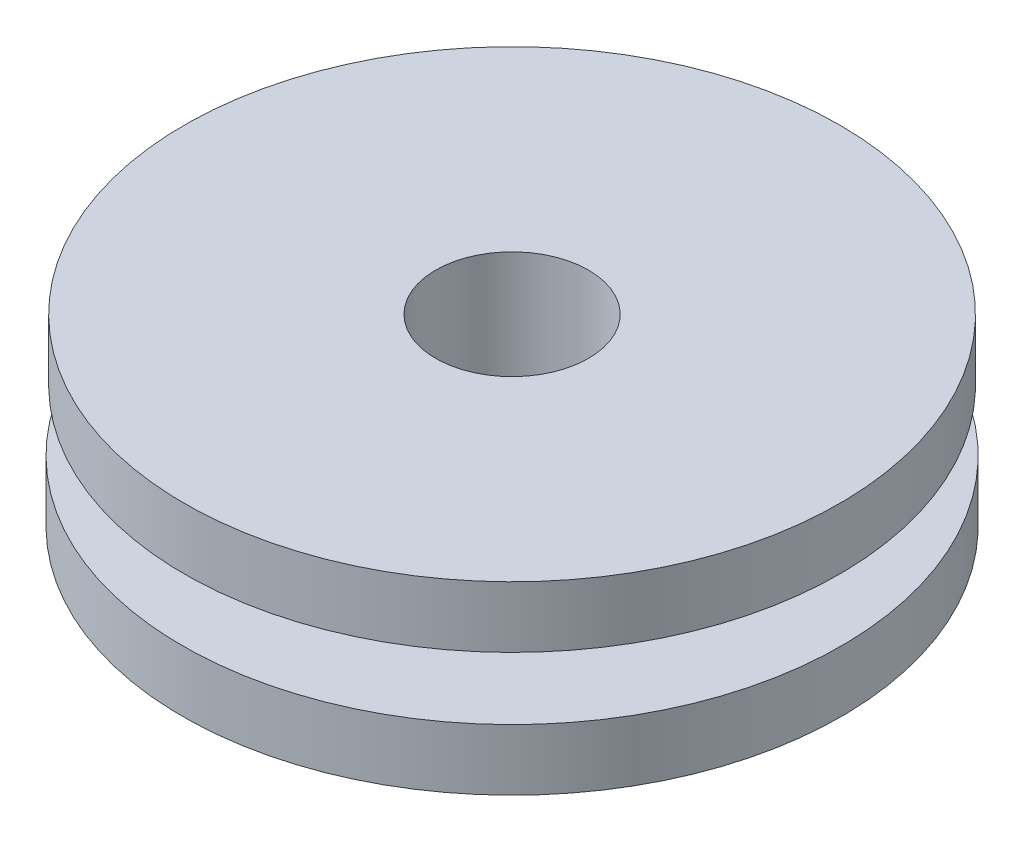
ISO-10303-21;
HEADER;
FILE_DESCRIPTION(('STEP AP214'),'2;1');
FILE_NAME('part.step','',(''),(''),'','','');
FILE_SCHEMA(('AUTOMOTIVE_DESIGN { 1 0 10303 214 1 1 1 1 }'));
ENDSEC;
DATA;
#1=APPLICATION_CONTEXT('core data for automotive mechanical design processes');
#2=APPLICATION_PROTOCOL_DEFINITION('international standard','automotive_design',2000,#1);
#3=PRODUCT_CONTEXT('',#1,'mechanical');
#4=PRODUCT('Part','Part','',(#3));
#5=PRODUCT_RELATED_PRODUCT_CATEGORY('part','',(#4));
#6=PRODUCT_DEFINITION_FORMATION('','',#4);
#7=PRODUCT_DEFINITION_CONTEXT('part definition',#1,'design');
#8=PRODUCT_DEFINITION('design','',#6,#7);
#9=PRODUCT_DEFINITION_SHAPE('','',#8);
#10=(LENGTH_UNIT() NAMED_UNIT(*) SI_UNIT(.MILLI.,.METRE.));
#11=(NAMED_UNIT(*) PLANE_ANGLE_UNIT() SI_UNIT($,.RADIAN.));
#12=(NAMED_UNIT(*) SI_UNIT($,.STERADIAN.) SOLID_ANGLE_UNIT());
#13=UNCERTAINTY_MEASURE_WITH_UNIT(LENGTH_MEASURE(1.E-05),#10,'distance_accuracy_value','');
#14=(GEOMETRIC_REPRESENTATION_CONTEXT(3) GLOBAL_UNCERTAINTY_ASSIGNED_CONTEXT((#13)) GLOBAL_UNIT_ASSIGNED_CONTEXT((#10,
#11,#12)) REPRESENTATION_CONTEXT('',''));
#15=CARTESIAN_POINT('',(0.,0.,0.));
#16=DIRECTION('',(0.,0.,1.));
#17=DIRECTION('',(1.,0.,0.));
#18=AXIS2_PLACEMENT_3D('',#15,#16,#17);
#19=CARTESIAN_POINT('',(0.,-14.9998814377917,0.0274087506036777));
#20=DIRECTION('',(0.,1.,0.));
#21=DIRECTION('',(0.,0.,1.));
#22=AXIS2_PLACEMENT_3D('',#19,#20,#21);
#23=PLANE('',#22);
#24=CARTESIAN_POINT('',(0.,-14.9998814377917,-38.456139131109));
#25=DIRECTION('',(0.,-1.,0.));
#26=DIRECTION('',(0.,0.,-1.));
#27=AXIS2_PLACEMENT_3D('',#24,#25,#26);
#28=CIRCLE('',#27,12.4999999999987);
#29=CARTESIAN_POINT('',(0.,-14.9998814377917,-50.9561391311077));
#30=VERTEX_POINT('',#29);
#31=EDGE_CURVE('E69',#30,#30,#28,.T.);
#32=ORIENTED_EDGE('',*,*,#31,.F.);
#33=EDGE_LOOP('',(#32));
#34=FACE_BOUND('',#33,.T.);
#35=CARTESIAN_POINT('',(0.,-14.9998814377917,-38.456139131109));
#36=DIRECTION('',(0.,-1.,0.));
#37=DIRECTION('',(0.,0.,-1.));
#38=AXIS2_PLACEMENT_3D('',#35,#36,#37);
#39=CIRCLE('',#38,53.8717210405314);
#40=CARTESIAN_POINT('',(0.,-14.9998814377917,-92.3278601716404));
#41=VERTEX_POINT('',#40);
#42=EDGE_CURVE('E10',#41,#41,#39,.T.);
#43=ORIENTED_EDGE('',*,*,#42,.T.);
#44=EDGE_LOOP('',(#43));
#45=FACE_BOUND('',#44,.T.);
#46=ADVANCED_FACE('F41',(#34,#45),#23,.F.);
#47=CARTESIAN_POINT('',(0.,-15.,-38.456139131109));
#48=DIRECTION('',(0.,-1.,0.));
#49=DIRECTION('',(0.,0.,-1.));
#50=AXIS2_PLACEMENT_3D('',#47,#48,#49);
#51=CYLINDRICAL_SURFACE('',#50,53.8717210405314);
#52=ORIENTED_EDGE('',*,*,#42,.F.);
#53=EDGE_LOOP('',(#52));
#54=FACE_BOUND('',#53,.T.);
#55=CARTESIAN_POINT('',(0.,-4.99999415881957,-38.456139131109));
#56=DIRECTION('',(0.,-1.,0.));
#57=DIRECTION('',(0.,0.,-1.));
#58=AXIS2_PLACEMENT_3D('',#55,#56,#57);
#59=CIRCLE('',#58,53.8717210405314);
#60=CARTESIAN_POINT('',(0.,-4.99999415881957,-92.3278601716404));
#61=VERTEX_POINT('',#60);
#62=EDGE_CURVE('E47',#61,#61,#59,.T.);
#63=ORIENTED_EDGE('',*,*,#62,.T.);
#64=EDGE_LOOP('',(#63));
#65=FACE_BOUND('',#64,.T.);
#66=ADVANCED_FACE('F76',(#54,#65),#51,.T.);
#67=CARTESIAN_POINT('',(0.,-4.99999415881957,15.4155819094224));
#68=DIRECTION('',(0.,-1.,0.));
#69=DIRECTION('',(0.,0.,-1.));
#70=AXIS2_PLACEMENT_3D('',#67,#68,#69);
#71=PLANE('',#70);
#72=ORIENTED_EDGE('',*,*,#62,.F.);
#73=EDGE_LOOP('',(#72));
#74=FACE_BOUND('',#73,.T.);
#75=CARTESIAN_POINT('',(0.,-4.99999415881957,-38.456139131109));
#76=DIRECTION('',(0.,-1.,0.));
#77=DIRECTION('',(0.,0.,-1.));
#78=AXIS2_PLACEMENT_3D('',#75,#76,#77);
#79=CIRCLE('',#78,38.5657913033351);
#80=CARTESIAN_POINT('',(0.,-4.99999415881957,-77.0219304344441));
#81=VERTEX_POINT('',#80);
#82=EDGE_CURVE('E51',#81,#81,#79,.T.);
#83=ORIENTED_EDGE('',*,*,#82,.T.);
#84=EDGE_LOOP('',(#83));
#85=FACE_BOUND('',#84,.T.);
#86=ADVANCED_FACE('F80',(#74,#85),#71,.F.);
#87=CARTESIAN_POINT('',(0.,-15.,-38.456139131109));
#88=DIRECTION('',(0.,-1.,0.));
#89=DIRECTION('',(0.,0.,-1.));
#90=AXIS2_PLACEMENT_3D('',#87,#88,#89);
#91=CYLINDRICAL_SURFACE('',#90,38.5657913033351);
#92=ORIENTED_EDGE('',*,*,#82,.F.);
#93=EDGE_LOOP('',(#92));
#94=FACE_BOUND('',#93,.T.);
#95=CARTESIAN_POINT('',(0.,5.0000058289898,-38.456139131109));
#96=DIRECTION('',(0.,-1.,0.));
#97=DIRECTION('',(0.,0.,-1.));
#98=AXIS2_PLACEMENT_3D('',#95,#96,#97);
#99=CIRCLE('',#98,38.5657913033351);
#100=CARTESIAN_POINT('',(0.,5.0000058289898,-77.0219304344441));
#101=VERTEX_POINT('',#100);
#102=EDGE_CURVE('E55',#101,#101,#99,.T.);
#103=ORIENTED_EDGE('',*,*,#102,.T.);
#104=EDGE_LOOP('',(#103));
#105=FACE_BOUND('',#104,.T.);
#106=ADVANCED_FACE('F85',(#94,#105),#91,.T.);
#107=CARTESIAN_POINT('',(0.,5.0000058289898,0.109652172226136));
#108=DIRECTION('',(0.,1.,0.));
#109=DIRECTION('',(0.,0.,1.));
#110=AXIS2_PLACEMENT_3D('',#107,#108,#109);
#111=PLANE('',#110);
#112=ORIENTED_EDGE('',*,*,#102,.F.);
#113=EDGE_LOOP('',(#112));
#114=FACE_BOUND('',#113,.T.);
#115=CARTESIAN_POINT('',(0.,5.0000058289898,-38.456139131109));
#116=DIRECTION('',(0.,-1.,0.));
#117=DIRECTION('',(0.,0.,-1.));
#118=AXIS2_PLACEMENT_3D('',#115,#116,#117);
#119=CIRCLE('',#118,53.5657913033351);
#120=CARTESIAN_POINT('',(0.,5.0000058289898,-92.0219304344441));
#121=VERTEX_POINT('',#120);
#122=EDGE_CURVE('E60',#121,#121,#119,.T.);
#123=ORIENTED_EDGE('',*,*,#122,.T.);
#124=EDGE_LOOP('',(#123));
#125=FACE_BOUND('',#124,.T.);
#126=ADVANCED_FACE('F91',(#114,#125),#111,.F.);
#127=CARTESIAN_POINT('',(0.,-15.,-38.456139131109));
#128=DIRECTION('',(0.,-1.,0.));
#129=DIRECTION('',(0.,0.,-1.));
#130=AXIS2_PLACEMENT_3D('',#127,#128,#129);
#131=CYLINDRICAL_SURFACE('',#130,53.5657913033351);
#132=ORIENTED_EDGE('',*,*,#122,.F.);
#133=EDGE_LOOP('',(#132));
#134=FACE_BOUND('',#133,.T.);
#135=CARTESIAN_POINT('',(0.,15.0000058289898,-38.456139131109));
#136=DIRECTION('',(0.,-1.,0.));
#137=DIRECTION('',(0.,0.,-1.));
#138=AXIS2_PLACEMENT_3D('',#135,#136,#137);
#139=CIRCLE('',#138,53.5657913033351);
#140=CARTESIAN_POINT('',(0.,15.0000058289898,-92.0219304344441));
#141=VERTEX_POINT('',#140);
#142=EDGE_CURVE('E63',#141,#141,#139,.T.);
#143=ORIENTED_EDGE('',*,*,#142,.T.);
#144=EDGE_LOOP('',(#143));
#145=FACE_BOUND('',#144,.T.);
#146=ADVANCED_FACE('F95',(#134,#145),#131,.T.);
#147=CARTESIAN_POINT('',(0.,15.0000058289898,0.109652172226143));
#148=DIRECTION('',(0.,-1.,0.));
#149=DIRECTION('',(0.,0.,-1.));
#150=AXIS2_PLACEMENT_3D('',#147,#148,#149);
#151=PLANE('',#150);
#152=ORIENTED_EDGE('',*,*,#142,.F.);
#153=EDGE_LOOP('',(#152));
#154=FACE_BOUND('',#153,.T.);
#155=CARTESIAN_POINT('',(0.,15.0000058289898,-38.456139131109));
#156=DIRECTION('',(0.,-1.,0.));
#157=DIRECTION('',(0.,0.,-1.));
#158=AXIS2_PLACEMENT_3D('',#155,#156,#157);
#159=CIRCLE('',#158,12.4999999999987);
#160=CARTESIAN_POINT('',(0.,15.0000058289898,-50.9561391311077));
#161=VERTEX_POINT('',#160);
#162=EDGE_CURVE('E66',#161,#161,#159,.T.);
#163=ORIENTED_EDGE('',*,*,#162,.T.);
#164=EDGE_LOOP('',(#163));
#165=FACE_BOUND('',#164,.T.);
#166=ADVANCED_FACE('F99',(#154,#165),#151,.F.);
#167=CARTESIAN_POINT('',(0.,-15.,-38.456139131109));
#168=DIRECTION('',(0.,-1.,0.));
#169=DIRECTION('',(0.,0.,-1.));
#170=AXIS2_PLACEMENT_3D('',#167,#168,#169);
#171=CYLINDRICAL_SURFACE('',#170,12.4999999999987);
#172=ORIENTED_EDGE('',*,*,#162,.F.);
#173=EDGE_LOOP('',(#172));
#174=FACE_BOUND('',#173,.T.);
#175=ORIENTED_EDGE('',*,*,#31,.T.);
#176=EDGE_LOOP('',(#175));
#177=FACE_BOUND('',#176,.T.);
#178=ADVANCED_FACE('F73',(#174,#177),#171,.F.);
#179=CLOSED_SHELL('',(#46,#66,#86,#106,#126,#146,#166,#178));
#180=MANIFOLD_SOLID_BREP('B2',#179);
#181=ADVANCED_BREP_SHAPE_REPRESENTATION('',(#18,#180),#14);
#182=SHAPE_DEFINITION_REPRESENTATION(#9,#181);
ENDSEC;
END-ISO-10303-21;
